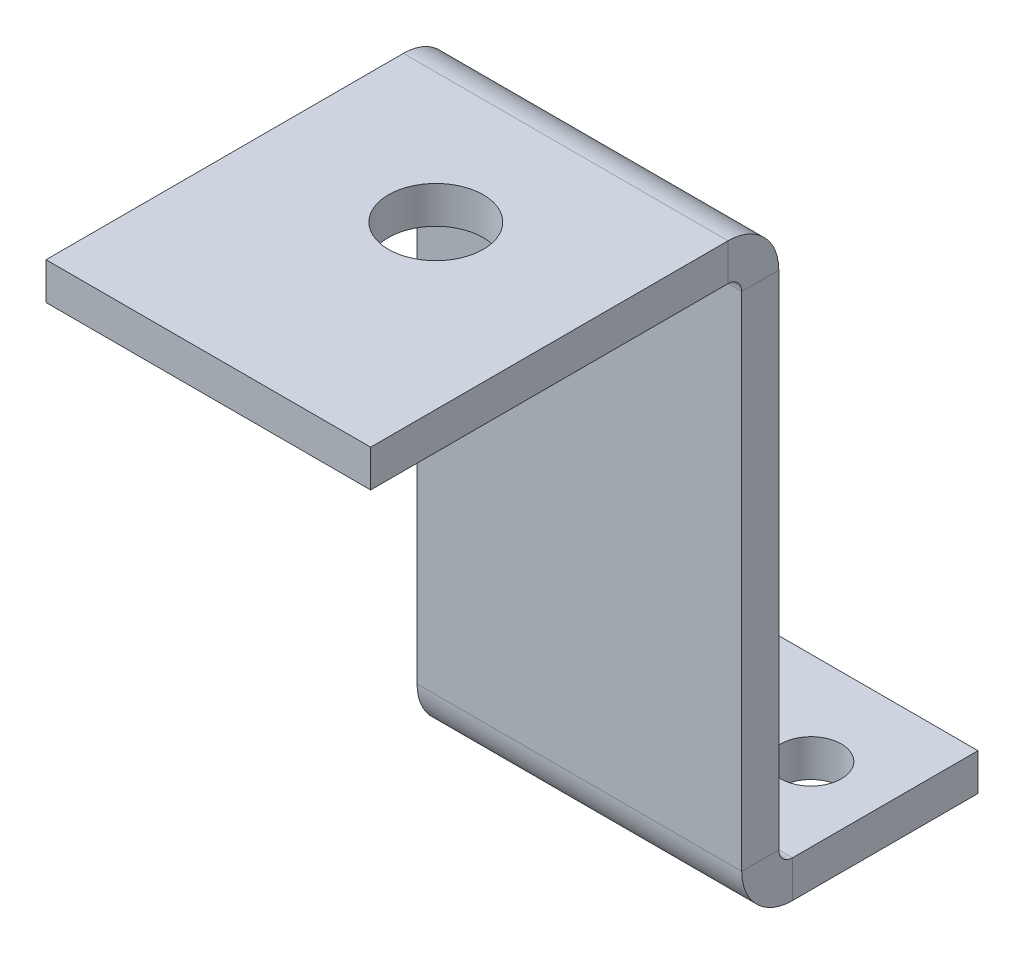
ISO-10303-21;
HEADER;
FILE_DESCRIPTION(('STEP AP214'),'2;1');
FILE_NAME('part.step','',(''),(''),'','','');
FILE_SCHEMA(('AUTOMOTIVE_DESIGN { 1 0 10303 214 1 1 1 1 }'));
ENDSEC;
DATA;
#1=APPLICATION_CONTEXT('core data for automotive mechanical design processes');
#2=APPLICATION_PROTOCOL_DEFINITION('international standard','automotive_design',2000,#1);
#3=PRODUCT_CONTEXT('',#1,'mechanical');
#4=PRODUCT('Part','Part','',(#3));
#5=PRODUCT_RELATED_PRODUCT_CATEGORY('part','',(#4));
#6=PRODUCT_DEFINITION_FORMATION('','',#4);
#7=PRODUCT_DEFINITION_CONTEXT('part definition',#1,'design');
#8=PRODUCT_DEFINITION('design','',#6,#7);
#9=PRODUCT_DEFINITION_SHAPE('','',#8);
#10=(LENGTH_UNIT() NAMED_UNIT(*) SI_UNIT(.MILLI.,.METRE.));
#11=(NAMED_UNIT(*) PLANE_ANGLE_UNIT() SI_UNIT($,.RADIAN.));
#12=(NAMED_UNIT(*) SI_UNIT($,.STERADIAN.) SOLID_ANGLE_UNIT());
#13=UNCERTAINTY_MEASURE_WITH_UNIT(LENGTH_MEASURE(1.E-05),#10,'distance_accuracy_value','');
#14=(GEOMETRIC_REPRESENTATION_CONTEXT(3) GLOBAL_UNCERTAINTY_ASSIGNED_CONTEXT((#13)) GLOBAL_UNIT_ASSIGNED_CONTEXT((#10,
#11,#12)) REPRESENTATION_CONTEXT('',''));
#15=CARTESIAN_POINT('',(0.,0.,0.));
#16=DIRECTION('',(0.,0.,1.));
#17=DIRECTION('',(1.,0.,0.));
#18=AXIS2_PLACEMENT_3D('',#15,#16,#17);
#19=CARTESIAN_POINT('',(0.,0.,0.));
#20=DIRECTION('',(0.,1.,0.));
#21=DIRECTION('',(0.,0.,1.));
#22=AXIS2_PLACEMENT_3D('',#19,#20,#21);
#23=PLANE('',#22);
#24=CARTESIAN_POINT('',(-19.2867132867133,0.,-16.3298368298368));
#25=DIRECTION('',(0.,1.,0.));
#26=DIRECTION('',(0.,0.,1.));
#27=AXIS2_PLACEMENT_3D('',#24,#25,#26);
#28=CIRCLE('',#27,1.63195);
#29=CARTESIAN_POINT('',(-19.2867132867133,0.,-14.6978868298368));
#30=VERTEX_POINT('',#29);
#31=EDGE_CURVE('E277',#30,#30,#28,.F.);
#32=ORIENTED_EDGE('',*,*,#31,.T.);
#33=EDGE_LOOP('',(#32));
#34=FACE_BOUND('',#33,.T.);
#35=DIRECTION('',(0.,0.,1.));
#36=VECTOR('',#35,1.);
#37=CARTESIAN_POINT('',(-23.2867132867133,0.,-21.3298368298368));
#38=LINE('',#37,#36);
#39=CARTESIAN_POINT('',(-23.2867132867133,0.,-21.3298368298368));
#40=VERTEX_POINT('',#39);
#41=CARTESIAN_POINT('',(-23.2867132867133,0.,-11.3298368298368));
#42=VERTEX_POINT('',#41);
#43=EDGE_CURVE('E286',#40,#42,#38,.T.);
#44=ORIENTED_EDGE('',*,*,#43,.T.);
#45=DIRECTION('',(1.,0.,0.));
#46=VECTOR('',#45,1.);
#47=CARTESIAN_POINT('',(-23.2867132867133,0.,-11.3298368298368));
#48=LINE('',#47,#46);
#49=CARTESIAN_POINT('',(-5.78671328671329,0.,-11.3298368298368));
#50=VERTEX_POINT('',#49);
#51=EDGE_CURVE('E298',#42,#50,#48,.T.);
#52=ORIENTED_EDGE('',*,*,#51,.T.);
#53=DIRECTION('',(0.,0.,-1.));
#54=VECTOR('',#53,1.);
#55=CARTESIAN_POINT('',(-5.78671328671329,0.,-21.3298368298368));
#56=LINE('',#55,#54);
#57=CARTESIAN_POINT('',(-5.78671328671329,0.,-21.3298368298368));
#58=VERTEX_POINT('',#57);
#59=EDGE_CURVE('E301',#50,#58,#56,.T.);
#60=ORIENTED_EDGE('',*,*,#59,.T.);
#61=DIRECTION('',(-1.,0.,0.));
#62=VECTOR('',#61,1.);
#63=CARTESIAN_POINT('',(-23.2867132867133,0.,-21.3298368298368));
#64=LINE('',#63,#62);
#65=EDGE_CURVE('E289',#58,#40,#64,.T.);
#66=ORIENTED_EDGE('',*,*,#65,.T.);
#67=EDGE_LOOP('',(#44,#52,#60,#66));
#68=FACE_BOUND('',#67,.T.);
#69=CARTESIAN_POINT('',(-9.78671328671328,0.,-16.3298368298368));
#70=DIRECTION('',(0.,1.,0.));
#71=DIRECTION('',(0.,0.,1.));
#72=AXIS2_PLACEMENT_3D('',#69,#70,#71);
#73=CIRCLE('',#72,1.63195);
#74=CARTESIAN_POINT('',(-9.78671328671328,0.,-14.6978868298368));
#75=VERTEX_POINT('',#74);
#76=EDGE_CURVE('E283',#75,#75,#73,.F.);
#77=ORIENTED_EDGE('',*,*,#76,.T.);
#78=EDGE_LOOP('',(#77));
#79=FACE_BOUND('',#78,.T.);
#80=ADVANCED_FACE('F83',(#34,#68,#79),#23,.T.);
#81=CARTESIAN_POINT('',(-23.2867132867133,-2.,-21.3298368298368));
#82=DIRECTION('',(-1.,0.,0.));
#83=DIRECTION('',(0.,0.,1.));
#84=AXIS2_PLACEMENT_3D('',#81,#82,#83);
#85=PLANE('',#84);
#86=ORIENTED_EDGE('',*,*,#43,.F.);
#87=DIRECTION('',(0.,1.,0.));
#88=VECTOR('',#87,1.);
#89=CARTESIAN_POINT('',(-23.2867132867133,-2.,-21.3298368298368));
#90=LINE('',#89,#88);
#91=CARTESIAN_POINT('',(-23.2867132867133,-2.,-21.3298368298368));
#92=VERTEX_POINT('',#91);
#93=EDGE_CURVE('E13',#92,#40,#90,.T.);
#94=ORIENTED_EDGE('',*,*,#93,.F.);
#95=DIRECTION('',(0.,0.,1.));
#96=VECTOR('',#95,1.);
#97=CARTESIAN_POINT('',(-23.2867132867133,-2.,-21.3298368298368));
#98=LINE('',#97,#96);
#99=CARTESIAN_POINT('',(-23.2867132867133,-2.,-11.3298368298368));
#100=VERTEX_POINT('',#99);
#101=EDGE_CURVE('E287',#92,#100,#98,.T.);
#102=ORIENTED_EDGE('',*,*,#101,.T.);
#103=DIRECTION('',(0.,1.,0.));
#104=VECTOR('',#103,1.);
#105=CARTESIAN_POINT('',(-23.2867132867133,-2.,-11.3298368298368));
#106=LINE('',#105,#104);
#107=EDGE_CURVE('E295',#100,#42,#106,.T.);
#108=ORIENTED_EDGE('',*,*,#107,.T.);
#109=EDGE_LOOP('',(#86,#94,#102,#108));
#110=FACE_BOUND('',#109,.T.);
#111=ADVANCED_FACE('F85',(#110),#85,.T.);
#112=CARTESIAN_POINT('',(-23.2867132867133,-2.,-21.3298368298368));
#113=DIRECTION('',(0.,0.,-1.));
#114=DIRECTION('',(-1.,0.,0.));
#115=AXIS2_PLACEMENT_3D('',#112,#113,#114);
#116=PLANE('',#115);
#117=ORIENTED_EDGE('',*,*,#65,.F.);
#118=DIRECTION('',(0.,1.,0.));
#119=VECTOR('',#118,1.);
#120=CARTESIAN_POINT('',(-5.78671328671329,-2.,-21.3298368298368));
#121=LINE('',#120,#119);
#122=CARTESIAN_POINT('',(-5.78671328671329,-2.,-21.3298368298368));
#123=VERTEX_POINT('',#122);
#124=EDGE_CURVE('E93',#123,#58,#121,.T.);
#125=ORIENTED_EDGE('',*,*,#124,.F.);
#126=DIRECTION('',(-1.,0.,0.));
#127=VECTOR('',#126,1.);
#128=CARTESIAN_POINT('',(-23.2867132867133,-2.,-21.3298368298368));
#129=LINE('',#128,#127);
#130=EDGE_CURVE('E293',#123,#92,#129,.T.);
#131=ORIENTED_EDGE('',*,*,#130,.T.);
#132=ORIENTED_EDGE('',*,*,#93,.T.);
#133=EDGE_LOOP('',(#117,#125,#131,#132));
#134=FACE_BOUND('',#133,.T.);
#135=ADVANCED_FACE('F372',(#134),#116,.T.);
#136=CARTESIAN_POINT('',(-5.78671328671329,-2.,-21.3298368298368));
#137=DIRECTION('',(1.,0.,0.));
#138=DIRECTION('',(0.,0.,-1.));
#139=AXIS2_PLACEMENT_3D('',#136,#137,#138);
#140=PLANE('',#139);
#141=ORIENTED_EDGE('',*,*,#59,.F.);
#142=DIRECTION('',(0.,1.,0.));
#143=VECTOR('',#142,1.);
#144=CARTESIAN_POINT('',(-5.78671328671329,-2.,-11.3298368298368));
#145=LINE('',#144,#143);
#146=CARTESIAN_POINT('',(-5.78671328671329,-2.,-11.3298368298368));
#147=VERTEX_POINT('',#146);
#148=EDGE_CURVE('E306',#147,#50,#145,.T.);
#149=ORIENTED_EDGE('',*,*,#148,.F.);
#150=DIRECTION('',(0.,0.,-1.));
#151=VECTOR('',#150,1.);
#152=CARTESIAN_POINT('',(-5.78671328671329,-2.,-21.3298368298368));
#153=LINE('',#152,#151);
#154=EDGE_CURVE('E291',#147,#123,#153,.T.);
#155=ORIENTED_EDGE('',*,*,#154,.T.);
#156=ORIENTED_EDGE('',*,*,#124,.T.);
#157=EDGE_LOOP('',(#141,#149,#155,#156));
#158=FACE_BOUND('',#157,.T.);
#159=ADVANCED_FACE('F378',(#158),#140,.T.);
#160=CARTESIAN_POINT('',(0.,-2.,0.));
#161=DIRECTION('',(0.,1.,0.));
#162=DIRECTION('',(0.,0.,1.));
#163=AXIS2_PLACEMENT_3D('',#160,#161,#162);
#164=PLANE('',#163);
#165=CARTESIAN_POINT('',(-19.2867132867133,-2.,-16.3298368298368));
#166=DIRECTION('',(0.,-1.,0.));
#167=DIRECTION('',(0.,0.,-1.));
#168=AXIS2_PLACEMENT_3D('',#165,#166,#167);
#169=CIRCLE('',#168,1.63195);
#170=CARTESIAN_POINT('',(-19.2867132867133,-2.,-17.9617868298368));
#171=VERTEX_POINT('',#170);
#172=EDGE_CURVE('E266',#171,#171,#169,.T.);
#173=ORIENTED_EDGE('',*,*,#172,.F.);
#174=EDGE_LOOP('',(#173));
#175=FACE_BOUND('',#174,.T.);
#176=CARTESIAN_POINT('',(-9.78671328671328,-2.,-16.3298368298368));
#177=DIRECTION('',(0.,-1.,0.));
#178=DIRECTION('',(0.,0.,-1.));
#179=AXIS2_PLACEMENT_3D('',#176,#177,#178);
#180=CIRCLE('',#179,1.63195);
#181=CARTESIAN_POINT('',(-9.78671328671328,-2.,-17.9617868298368));
#182=VERTEX_POINT('',#181);
#183=EDGE_CURVE('E280',#182,#182,#180,.T.);
#184=ORIENTED_EDGE('',*,*,#183,.F.);
#185=EDGE_LOOP('',(#184));
#186=FACE_BOUND('',#185,.T.);
#187=ORIENTED_EDGE('',*,*,#101,.F.);
#188=ORIENTED_EDGE('',*,*,#130,.F.);
#189=ORIENTED_EDGE('',*,*,#154,.F.);
#190=DIRECTION('',(1.,0.,0.));
#191=VECTOR('',#190,1.);
#192=CARTESIAN_POINT('',(-23.2867132867133,-2.,-11.3298368298368));
#193=LINE('',#192,#191);
#194=EDGE_CURVE('E125',#100,#147,#193,.T.);
#195=ORIENTED_EDGE('',*,*,#194,.F.);
#196=EDGE_LOOP('',(#187,#188,#189,#195));
#197=FACE_BOUND('',#196,.T.);
#198=ADVANCED_FACE('F375',(#175,#186,#197),#164,.F.);
#199=CARTESIAN_POINT('',(-9.78671328671328,-2.,-16.3298368298368));
#200=DIRECTION('',(0.,-1.,0.));
#201=DIRECTION('',(0.,0.,-1.));
#202=AXIS2_PLACEMENT_3D('',#199,#200,#201);
#203=CYLINDRICAL_SURFACE('',#202,1.63195);
#204=ORIENTED_EDGE('',*,*,#76,.F.);
#205=EDGE_LOOP('',(#204));
#206=FACE_BOUND('',#205,.T.);
#207=ORIENTED_EDGE('',*,*,#183,.T.);
#208=EDGE_LOOP('',(#207));
#209=FACE_BOUND('',#208,.T.);
#210=ADVANCED_FACE('F383',(#206,#209),#203,.F.);
#211=CARTESIAN_POINT('',(-19.2867132867133,-2.,-16.3298368298368));
#212=DIRECTION('',(0.,-1.,0.));
#213=DIRECTION('',(0.,0.,-1.));
#214=AXIS2_PLACEMENT_3D('',#211,#212,#213);
#215=CYLINDRICAL_SURFACE('',#214,1.63195);
#216=ORIENTED_EDGE('',*,*,#31,.F.);
#217=EDGE_LOOP('',(#216));
#218=FACE_BOUND('',#217,.T.);
#219=ORIENTED_EDGE('',*,*,#172,.T.);
#220=EDGE_LOOP('',(#219));
#221=FACE_BOUND('',#220,.T.);
#222=ADVANCED_FACE('F423',(#218,#221),#215,.F.);
#223=CARTESIAN_POINT('',(-23.2867132867133,0.736599999999997,-11.3298368298368));
#224=DIRECTION('',(-1.,0.,0.));
#225=DIRECTION('',(0.,0.,1.));
#226=AXIS2_PLACEMENT_3D('',#223,#224,#225);
#227=PLANE('',#226);
#228=DIRECTION('',(0.,0.,-1.));
#229=VECTOR('',#228,1.);
#230=CARTESIAN_POINT('',(-23.2867132867133,0.736599999999997,-8.59323682983683));
#231=LINE('',#230,#229);
#232=CARTESIAN_POINT('',(-23.2867132867133,0.736599999999997,-10.5932368298368));
#233=VERTEX_POINT('',#232);
#234=CARTESIAN_POINT('',(-23.2867132867133,0.736599999999997,-8.59323682983683));
#235=VERTEX_POINT('',#234);
#236=EDGE_CURVE('E222',#233,#235,#231,.F.);
#237=ORIENTED_EDGE('',*,*,#236,.F.);
#238=CARTESIAN_POINT('',(-23.2867132867133,0.736599999999997,-11.3298368298368));
#239=DIRECTION('',(1.,0.,0.));
#240=DIRECTION('',(0.,0.,-1.));
#241=AXIS2_PLACEMENT_3D('',#238,#239,#240);
#242=CIRCLE('',#241,0.736599999999997);
#243=EDGE_CURVE('E270',#42,#233,#242,.F.);
#244=ORIENTED_EDGE('',*,*,#243,.F.);
#245=ORIENTED_EDGE('',*,*,#107,.F.);
#246=CARTESIAN_POINT('',(-23.2867132867133,0.736599999999997,-11.3298368298368));
#247=DIRECTION('',(1.,0.,0.));
#248=DIRECTION('',(0.,0.,-1.));
#249=AXIS2_PLACEMENT_3D('',#246,#247,#248);
#250=CIRCLE('',#249,2.7366);
#251=EDGE_CURVE('E263',#100,#235,#250,.F.);
#252=ORIENTED_EDGE('',*,*,#251,.T.);
#253=EDGE_LOOP('',(#237,#244,#245,#252));
#254=FACE_BOUND('',#253,.T.);
#255=ADVANCED_FACE('F319',(#254),#227,.T.);
#256=CARTESIAN_POINT('',(-5.78671328671329,0.736599999999997,-11.3298368298368));
#257=DIRECTION('',(-1.,0.,0.));
#258=DIRECTION('',(0.,0.,1.));
#259=AXIS2_PLACEMENT_3D('',#256,#257,#258);
#260=PLANE('',#259);
#261=CARTESIAN_POINT('',(-5.78671328671329,0.736599999999997,-11.3298368298368));
#262=DIRECTION('',(1.,0.,0.));
#263=DIRECTION('',(0.,0.,-1.));
#264=AXIS2_PLACEMENT_3D('',#261,#262,#263);
#265=CIRCLE('',#264,0.736599999999997);
#266=CARTESIAN_POINT('',(-5.78671328671329,0.736599999999997,-10.5932368298368));
#267=VERTEX_POINT('',#266);
#268=EDGE_CURVE('E235',#267,#50,#265,.T.);
#269=ORIENTED_EDGE('',*,*,#268,.F.);
#270=DIRECTION('',(0.,0.,-1.));
#271=VECTOR('',#270,1.);
#272=CARTESIAN_POINT('',(-5.78671328671329,0.736599999999997,-10.5932368298368));
#273=LINE('',#272,#271);
#274=CARTESIAN_POINT('',(-5.78671328671329,0.736599999999997,-8.59323682983683));
#275=VERTEX_POINT('',#274);
#276=EDGE_CURVE('E256',#267,#275,#273,.F.);
#277=ORIENTED_EDGE('',*,*,#276,.T.);
#278=CARTESIAN_POINT('',(-5.78671328671329,0.736599999999997,-11.3298368298368));
#279=DIRECTION('',(1.,0.,0.));
#280=DIRECTION('',(0.,0.,-1.));
#281=AXIS2_PLACEMENT_3D('',#278,#279,#280);
#282=CIRCLE('',#281,2.7366);
#283=EDGE_CURVE('E267',#275,#147,#282,.T.);
#284=ORIENTED_EDGE('',*,*,#283,.T.);
#285=ORIENTED_EDGE('',*,*,#148,.T.);
#286=EDGE_LOOP('',(#269,#277,#284,#285));
#287=FACE_BOUND('',#286,.T.);
#288=ADVANCED_FACE('F390',(#287),#260,.F.);
#289=CARTESIAN_POINT('',(-5.78671328671329,0.736599999999997,-11.3298368298368));
#290=DIRECTION('',(1.,0.,0.));
#291=DIRECTION('',(0.,0.,1.));
#292=AXIS2_PLACEMENT_3D('',#289,#290,#291);
#293=CYLINDRICAL_SURFACE('',#292,2.7366);
#294=ORIENTED_EDGE('',*,*,#194,.T.);
#295=ORIENTED_EDGE('',*,*,#283,.F.);
#296=DIRECTION('',(1.,0.,0.));
#297=VECTOR('',#296,1.);
#298=CARTESIAN_POINT('',(-23.2867132867133,0.736599999999997,-8.59323682983683));
#299=LINE('',#298,#297);
#300=EDGE_CURVE('E254',#275,#235,#299,.F.);
#301=ORIENTED_EDGE('',*,*,#300,.T.);
#302=ORIENTED_EDGE('',*,*,#251,.F.);
#303=EDGE_LOOP('',(#294,#295,#301,#302));
#304=FACE_BOUND('',#303,.T.);
#305=ADVANCED_FACE('F389',(#304),#293,.T.);
#306=CARTESIAN_POINT('',(-5.78671328671329,0.736599999999997,-11.3298368298368));
#307=DIRECTION('',(1.,0.,0.));
#308=DIRECTION('',(0.,0.,1.));
#309=AXIS2_PLACEMENT_3D('',#306,#307,#308);
#310=CYLINDRICAL_SURFACE('',#309,0.736599999999997);
#311=ORIENTED_EDGE('',*,*,#51,.F.);
#312=ORIENTED_EDGE('',*,*,#243,.T.);
#313=DIRECTION('',(1.,0.,0.));
#314=VECTOR('',#313,1.);
#315=CARTESIAN_POINT('',(-23.2867132867133,0.736599999999997,-10.5932368298368));
#316=LINE('',#315,#314);
#317=EDGE_CURVE('E259',#233,#267,#316,.T.);
#318=ORIENTED_EDGE('',*,*,#317,.T.);
#319=ORIENTED_EDGE('',*,*,#268,.T.);
#320=EDGE_LOOP('',(#311,#312,#318,#319));
#321=FACE_BOUND('',#320,.T.);
#322=ADVANCED_FACE('F316',(#321),#310,.F.);
#323=CARTESIAN_POINT('',(-23.2867132867133,0.,-8.59323682983683));
#324=DIRECTION('',(1.,0.,0.));
#325=DIRECTION('',(0.,0.,-1.));
#326=AXIS2_PLACEMENT_3D('',#323,#324,#325);
#327=PLANE('',#326);
#328=ORIENTED_EDGE('',*,*,#236,.T.);
#329=DIRECTION('',(0.,-1.,0.));
#330=VECTOR('',#329,1.);
#331=CARTESIAN_POINT('',(-23.2867132867133,0.,-8.59323682983683));
#332=LINE('',#331,#330);
#333=CARTESIAN_POINT('',(-23.2867132867133,27.8,-8.59323682983683));
#334=VERTEX_POINT('',#333);
#335=EDGE_CURVE('E243',#334,#235,#332,.T.);
#336=ORIENTED_EDGE('',*,*,#335,.F.);
#337=DIRECTION('',(0.,0.,-1.));
#338=VECTOR('',#337,1.);
#339=CARTESIAN_POINT('',(-23.2867132867133,27.8,-8.59323682983683));
#340=LINE('',#339,#338);
#341=CARTESIAN_POINT('',(-23.2867132867133,27.8,-10.5932368298368));
#342=VERTEX_POINT('',#341);
#343=EDGE_CURVE('E236',#334,#342,#340,.T.);
#344=ORIENTED_EDGE('',*,*,#343,.T.);
#345=DIRECTION('',(0.,1.,0.));
#346=VECTOR('',#345,1.);
#347=CARTESIAN_POINT('',(-23.2867132867133,0.,-10.5932368298368));
#348=LINE('',#347,#346);
#349=EDGE_CURVE('E251',#342,#233,#348,.F.);
#350=ORIENTED_EDGE('',*,*,#349,.T.);
#351=EDGE_LOOP('',(#328,#336,#344,#350));
#352=FACE_BOUND('',#351,.T.);
#353=ADVANCED_FACE('F322',(#352),#327,.F.);
#354=CARTESIAN_POINT('',(-5.78671328671329,27.8,-8.59323682983683));
#355=DIRECTION('',(-1.,0.,0.));
#356=DIRECTION('',(0.,0.,1.));
#357=AXIS2_PLACEMENT_3D('',#354,#355,#356);
#358=PLANE('',#357);
#359=ORIENTED_EDGE('',*,*,#276,.F.);
#360=DIRECTION('',(0.,-1.,0.));
#361=VECTOR('',#360,1.);
#362=CARTESIAN_POINT('',(-5.78671328671329,27.8,-10.5932368298368));
#363=LINE('',#362,#361);
#364=CARTESIAN_POINT('',(-5.78671328671329,27.8,-10.5932368298368));
#365=VERTEX_POINT('',#364);
#366=EDGE_CURVE('E249',#267,#365,#363,.F.);
#367=ORIENTED_EDGE('',*,*,#366,.T.);
#368=DIRECTION('',(0.,0.,-1.));
#369=VECTOR('',#368,1.);
#370=CARTESIAN_POINT('',(-5.78671328671329,27.8,-8.59323682983683));
#371=LINE('',#370,#369);
#372=CARTESIAN_POINT('',(-5.78671328671329,27.8,-8.59323682983683));
#373=VERTEX_POINT('',#372);
#374=EDGE_CURVE('E232',#373,#365,#371,.T.);
#375=ORIENTED_EDGE('',*,*,#374,.F.);
#376=DIRECTION('',(0.,1.,0.));
#377=VECTOR('',#376,1.);
#378=CARTESIAN_POINT('',(-5.78671328671329,0.,-8.59323682983683));
#379=LINE('',#378,#377);
#380=EDGE_CURVE('E241',#275,#373,#379,.T.);
#381=ORIENTED_EDGE('',*,*,#380,.F.);
#382=EDGE_LOOP('',(#359,#367,#375,#381));
#383=FACE_BOUND('',#382,.T.);
#384=ADVANCED_FACE('F394',(#383),#358,.F.);
#385=CARTESIAN_POINT('',(0.,0.,-8.59323682983683));
#386=DIRECTION('',(0.,0.,-1.));
#387=DIRECTION('',(-1.,0.,0.));
#388=AXIS2_PLACEMENT_3D('',#385,#386,#387);
#389=PLANE('',#388);
#390=ORIENTED_EDGE('',*,*,#300,.F.);
#391=ORIENTED_EDGE('',*,*,#380,.T.);
#392=DIRECTION('',(-1.,0.,0.));
#393=VECTOR('',#392,1.);
#394=CARTESIAN_POINT('',(0.,27.8,-8.59323682983683));
#395=LINE('',#394,#393);
#396=EDGE_CURVE('E239',#373,#334,#395,.T.);
#397=ORIENTED_EDGE('',*,*,#396,.T.);
#398=ORIENTED_EDGE('',*,*,#335,.T.);
#399=EDGE_LOOP('',(#390,#391,#397,#398));
#400=FACE_BOUND('',#399,.T.);
#401=ADVANCED_FACE('F326',(#400),#389,.F.);
#402=CARTESIAN_POINT('',(0.,0.,-10.5932368298368));
#403=DIRECTION('',(0.,0.,-1.));
#404=DIRECTION('',(-1.,0.,0.));
#405=AXIS2_PLACEMENT_3D('',#402,#403,#404);
#406=PLANE('',#405);
#407=ORIENTED_EDGE('',*,*,#366,.F.);
#408=ORIENTED_EDGE('',*,*,#317,.F.);
#409=ORIENTED_EDGE('',*,*,#349,.F.);
#410=DIRECTION('',(1.,0.,0.));
#411=VECTOR('',#410,1.);
#412=CARTESIAN_POINT('',(-23.2867132867133,27.8,-10.5932368298368));
#413=LINE('',#412,#411);
#414=EDGE_CURVE('E246',#365,#342,#413,.F.);
#415=ORIENTED_EDGE('',*,*,#414,.F.);
#416=EDGE_LOOP('',(#407,#408,#409,#415));
#417=FACE_BOUND('',#416,.T.);
#418=ADVANCED_FACE('F396',(#417),#406,.T.);
#419=CARTESIAN_POINT('',(-5.78671328671329,27.8,-7.85663682983683));
#420=DIRECTION('',(1.,0.,0.));
#421=DIRECTION('',(0.,0.,-1.));
#422=AXIS2_PLACEMENT_3D('',#419,#420,#421);
#423=PLANE('',#422);
#424=DIRECTION('',(0.,-1.,0.));
#425=VECTOR('',#424,1.);
#426=CARTESIAN_POINT('',(-5.78671328671329,30.5366,-7.85663682983684));
#427=LINE('',#426,#425);
#428=CARTESIAN_POINT('',(-5.78671328671329,28.5366,-7.85663682983683));
#429=VERTEX_POINT('',#428);
#430=CARTESIAN_POINT('',(-5.78671328671329,30.5366,-7.85663682983684));
#431=VERTEX_POINT('',#430);
#432=EDGE_CURVE('E202',#429,#431,#427,.F.);
#433=ORIENTED_EDGE('',*,*,#432,.F.);
#434=CARTESIAN_POINT('',(-5.78671328671329,27.8,-7.85663682983683));
#435=DIRECTION('',(-1.,0.,0.));
#436=DIRECTION('',(0.,0.,1.));
#437=AXIS2_PLACEMENT_3D('',#434,#435,#436);
#438=CIRCLE('',#437,0.7366);
#439=EDGE_CURVE('E226',#373,#429,#438,.F.);
#440=ORIENTED_EDGE('',*,*,#439,.F.);
#441=ORIENTED_EDGE('',*,*,#374,.T.);
#442=CARTESIAN_POINT('',(-5.78671328671329,27.8,-7.85663682983683));
#443=DIRECTION('',(-1.,0.,0.));
#444=DIRECTION('',(0.,0.,1.));
#445=AXIS2_PLACEMENT_3D('',#442,#443,#444);
#446=CIRCLE('',#445,2.7366);
#447=EDGE_CURVE('E219',#365,#431,#446,.F.);
#448=ORIENTED_EDGE('',*,*,#447,.T.);
#449=EDGE_LOOP('',(#433,#440,#441,#448));
#450=FACE_BOUND('',#449,.T.);
#451=ADVANCED_FACE('F336',(#450),#423,.T.);
#452=CARTESIAN_POINT('',(-23.2867132867133,27.8,-7.85663682983683));
#453=DIRECTION('',(1.,0.,0.));
#454=DIRECTION('',(0.,0.,-1.));
#455=AXIS2_PLACEMENT_3D('',#452,#453,#454);
#456=PLANE('',#455);
#457=CARTESIAN_POINT('',(-23.2867132867133,27.8,-7.85663682983683));
#458=DIRECTION('',(-1.,0.,0.));
#459=DIRECTION('',(0.,0.,1.));
#460=AXIS2_PLACEMENT_3D('',#457,#458,#459);
#461=CIRCLE('',#460,0.7366);
#462=CARTESIAN_POINT('',(-23.2867132867133,28.5366,-7.85663682983683));
#463=VERTEX_POINT('',#462);
#464=EDGE_CURVE('E229',#463,#334,#461,.T.);
#465=ORIENTED_EDGE('',*,*,#464,.F.);
#466=DIRECTION('',(0.,-1.,0.));
#467=VECTOR('',#466,1.);
#468=CARTESIAN_POINT('',(-23.2867132867133,28.5366,-7.85663682983683));
#469=LINE('',#468,#467);
#470=CARTESIAN_POINT('',(-23.2867132867133,30.5366,-7.85663682983684));
#471=VERTEX_POINT('',#470);
#472=EDGE_CURVE('E213',#463,#471,#469,.F.);
#473=ORIENTED_EDGE('',*,*,#472,.T.);
#474=CARTESIAN_POINT('',(-23.2867132867133,27.8,-7.85663682983683));
#475=DIRECTION('',(-1.,0.,0.));
#476=DIRECTION('',(0.,0.,1.));
#477=AXIS2_PLACEMENT_3D('',#474,#475,#476);
#478=CIRCLE('',#477,2.7366);
#479=EDGE_CURVE('E223',#471,#342,#478,.T.);
#480=ORIENTED_EDGE('',*,*,#479,.T.);
#481=ORIENTED_EDGE('',*,*,#343,.F.);
#482=EDGE_LOOP('',(#465,#473,#480,#481));
#483=FACE_BOUND('',#482,.T.);
#484=ADVANCED_FACE('F398',(#483),#456,.F.);
#485=CARTESIAN_POINT('',(-23.2867132867133,27.8,-7.85663682983683));
#486=DIRECTION('',(-1.,0.,0.));
#487=DIRECTION('',(0.,1.,0.));
#488=AXIS2_PLACEMENT_3D('',#485,#486,#487);
#489=CYLINDRICAL_SURFACE('',#488,2.7366);
#490=ORIENTED_EDGE('',*,*,#414,.T.);
#491=ORIENTED_EDGE('',*,*,#479,.F.);
#492=DIRECTION('',(-1.,0.,0.));
#493=VECTOR('',#492,1.);
#494=CARTESIAN_POINT('',(-5.78671328671329,30.5366,-7.85663682983684));
#495=LINE('',#494,#493);
#496=EDGE_CURVE('E211',#471,#431,#495,.F.);
#497=ORIENTED_EDGE('',*,*,#496,.T.);
#498=ORIENTED_EDGE('',*,*,#447,.F.);
#499=EDGE_LOOP('',(#490,#491,#497,#498));
#500=FACE_BOUND('',#499,.T.);
#501=ADVANCED_FACE('F339',(#500),#489,.T.);
#502=CARTESIAN_POINT('',(-23.2867132867133,27.8,-7.85663682983683));
#503=DIRECTION('',(-1.,0.,0.));
#504=DIRECTION('',(0.,1.,0.));
#505=AXIS2_PLACEMENT_3D('',#502,#503,#504);
#506=CYLINDRICAL_SURFACE('',#505,0.7366);
#507=ORIENTED_EDGE('',*,*,#396,.F.);
#508=ORIENTED_EDGE('',*,*,#439,.T.);
#509=DIRECTION('',(-1.,0.,0.));
#510=VECTOR('',#509,1.);
#511=CARTESIAN_POINT('',(-5.78671328671329,28.5366,-7.85663682983683));
#512=LINE('',#511,#510);
#513=EDGE_CURVE('E216',#429,#463,#512,.T.);
#514=ORIENTED_EDGE('',*,*,#513,.T.);
#515=ORIENTED_EDGE('',*,*,#464,.T.);
#516=EDGE_LOOP('',(#507,#508,#514,#515));
#517=FACE_BOUND('',#516,.T.);
#518=ADVANCED_FACE('F332',(#517),#506,.F.);
#519=CARTESIAN_POINT('',(-5.78671328671329,30.5366,-8.59323682983684));
#520=DIRECTION('',(-1.,0.,0.));
#521=DIRECTION('',(0.,0.,1.));
#522=AXIS2_PLACEMENT_3D('',#519,#520,#521);
#523=PLANE('',#522);
#524=ORIENTED_EDGE('',*,*,#432,.T.);
#525=DIRECTION('',(0.,0.,-1.));
#526=VECTOR('',#525,1.);
#527=CARTESIAN_POINT('',(-5.78671328671329,30.5366,-1.03433587941997E-13));
#528=LINE('',#527,#526);
#529=CARTESIAN_POINT('',(-5.78671328671329,30.5366000000001,11.4067631701632));
#530=VERTEX_POINT('',#529);
#531=EDGE_CURVE('E183',#530,#431,#528,.T.);
#532=ORIENTED_EDGE('',*,*,#531,.F.);
#533=DIRECTION('',(0.,-1.,0.));
#534=VECTOR('',#533,1.);
#535=CARTESIAN_POINT('',(-5.78671328671329,30.5366000000001,11.4067631701632));
#536=LINE('',#535,#534);
#537=CARTESIAN_POINT('',(-5.78671328671329,28.5366000000001,11.4067631701632));
#538=VERTEX_POINT('',#537);
#539=EDGE_CURVE('E189',#530,#538,#536,.T.);
#540=ORIENTED_EDGE('',*,*,#539,.T.);
#541=DIRECTION('',(0.,0.,1.));
#542=VECTOR('',#541,1.);
#543=CARTESIAN_POINT('',(-5.78671328671329,28.5366,-8.59323682983683));
#544=LINE('',#543,#542);
#545=EDGE_CURVE('E209',#538,#429,#544,.F.);
#546=ORIENTED_EDGE('',*,*,#545,.T.);
#547=EDGE_LOOP('',(#524,#532,#540,#546));
#548=FACE_BOUND('',#547,.T.);
#549=ADVANCED_FACE('F201',(#548),#523,.F.);
#550=CARTESIAN_POINT('',(-23.2867132867133,30.5366000000001,11.4067631701632));
#551=DIRECTION('',(1.,0.,0.));
#552=DIRECTION('',(0.,0.,-1.));
#553=AXIS2_PLACEMENT_3D('',#550,#551,#552);
#554=PLANE('',#553);
#555=ORIENTED_EDGE('',*,*,#472,.F.);
#556=DIRECTION('',(0.,0.,-1.));
#557=VECTOR('',#556,1.);
#558=CARTESIAN_POINT('',(-23.2867132867133,28.5366000000001,11.4067631701632));
#559=LINE('',#558,#557);
#560=CARTESIAN_POINT('',(-23.2867132867133,28.5366000000001,11.4067631701632));
#561=VERTEX_POINT('',#560);
#562=EDGE_CURVE('E205',#463,#561,#559,.F.);
#563=ORIENTED_EDGE('',*,*,#562,.T.);
#564=DIRECTION('',(0.,-1.,0.));
#565=VECTOR('',#564,1.);
#566=CARTESIAN_POINT('',(-23.2867132867133,30.5366000000001,11.4067631701632));
#567=LINE('',#566,#565);
#568=CARTESIAN_POINT('',(-23.2867132867133,30.5366000000001,11.4067631701632));
#569=VERTEX_POINT('',#568);
#570=EDGE_CURVE('E198',#569,#561,#567,.T.);
#571=ORIENTED_EDGE('',*,*,#570,.F.);
#572=DIRECTION('',(0.,0.,1.));
#573=VECTOR('',#572,1.);
#574=CARTESIAN_POINT('',(-23.2867132867133,30.5366,-1.03433587941997E-13));
#575=LINE('',#574,#573);
#576=EDGE_CURVE('E185',#471,#569,#575,.T.);
#577=ORIENTED_EDGE('',*,*,#576,.F.);
#578=EDGE_LOOP('',(#555,#563,#571,#577));
#579=FACE_BOUND('',#578,.T.);
#580=ADVANCED_FACE('F343',(#579),#554,.F.);
#581=CARTESIAN_POINT('',(0.,30.5366,-1.03433587941997E-13));
#582=DIRECTION('',(0.,-1.,0.));
#583=DIRECTION('',(0.,0.,-1.));
#584=AXIS2_PLACEMENT_3D('',#581,#582,#583);
#585=PLANE('',#584);
#586=CARTESIAN_POINT('',(-14.5367132867133,30.5366,-0.856636829836833));
#587=DIRECTION('',(0.,-1.,0.));
#588=DIRECTION('',(0.,0.,-1.));
#589=AXIS2_PLACEMENT_3D('',#586,#587,#588);
#590=CIRCLE('',#589,2.55269999999999);
#591=CARTESIAN_POINT('',(-14.5367132867133,30.5366,-3.40933682983682));
#592=VERTEX_POINT('',#591);
#593=EDGE_CURVE('E87',#592,#592,#590,.T.);
#594=ORIENTED_EDGE('',*,*,#593,.T.);
#595=EDGE_LOOP('',(#594));
#596=FACE_BOUND('',#595,.T.);
#597=ORIENTED_EDGE('',*,*,#496,.F.);
#598=ORIENTED_EDGE('',*,*,#576,.T.);
#599=DIRECTION('',(1.,0.,0.));
#600=VECTOR('',#599,1.);
#601=CARTESIAN_POINT('',(0.,30.5366000000001,11.4067631701632));
#602=LINE('',#601,#600);
#603=EDGE_CURVE('E178',#569,#530,#602,.T.);
#604=ORIENTED_EDGE('',*,*,#603,.T.);
#605=ORIENTED_EDGE('',*,*,#531,.T.);
#606=EDGE_LOOP('',(#597,#598,#604,#605));
#607=FACE_BOUND('',#606,.T.);
#608=ADVANCED_FACE('F181',(#596,#607),#585,.F.);
#609=CARTESIAN_POINT('',(0.,28.5366,0.));
#610=DIRECTION('',(0.,-1.,0.));
#611=DIRECTION('',(0.,0.,-1.));
#612=AXIS2_PLACEMENT_3D('',#609,#610,#611);
#613=PLANE('',#612);
#614=CARTESIAN_POINT('',(-14.5367132867133,28.5366,-0.856636829836833));
#615=DIRECTION('',(0.,-1.,0.));
#616=DIRECTION('',(0.,0.,-1.));
#617=AXIS2_PLACEMENT_3D('',#614,#615,#616);
#618=CIRCLE('',#617,2.55269999999999);
#619=CARTESIAN_POINT('',(-14.5367132867133,28.5366,-3.40933682983682));
#620=VERTEX_POINT('',#619);
#621=EDGE_CURVE('E347',#620,#620,#618,.T.);
#622=ORIENTED_EDGE('',*,*,#621,.F.);
#623=EDGE_LOOP('',(#622));
#624=FACE_BOUND('',#623,.T.);
#625=ORIENTED_EDGE('',*,*,#562,.F.);
#626=ORIENTED_EDGE('',*,*,#513,.F.);
#627=ORIENTED_EDGE('',*,*,#545,.F.);
#628=DIRECTION('',(-1.,0.,0.));
#629=VECTOR('',#628,1.);
#630=CARTESIAN_POINT('',(-5.78671328671329,28.5366000000001,11.4067631701632));
#631=LINE('',#630,#629);
#632=EDGE_CURVE('E194',#561,#538,#631,.F.);
#633=ORIENTED_EDGE('',*,*,#632,.F.);
#634=EDGE_LOOP('',(#625,#626,#627,#633));
#635=FACE_BOUND('',#634,.T.);
#636=ADVANCED_FACE('F362',(#624,#635),#613,.T.);
#637=CARTESIAN_POINT('',(-5.78671328671329,30.5366000000001,11.4067631701632));
#638=DIRECTION('',(0.,0.,-1.));
#639=DIRECTION('',(0.,1.,0.));
#640=AXIS2_PLACEMENT_3D('',#637,#638,#639);
#641=PLANE('',#640);
#642=ORIENTED_EDGE('',*,*,#632,.T.);
#643=ORIENTED_EDGE('',*,*,#539,.F.);
#644=ORIENTED_EDGE('',*,*,#603,.F.);
#645=ORIENTED_EDGE('',*,*,#570,.T.);
#646=EDGE_LOOP('',(#642,#643,#644,#645));
#647=FACE_BOUND('',#646,.T.);
#648=ADVANCED_FACE('F192',(#647),#641,.F.);
#649=CARTESIAN_POINT('',(-14.5367132867133,28.5366,-0.856636829836833));
#650=DIRECTION('',(0.,-1.,0.));
#651=DIRECTION('',(0.,0.,-1.));
#652=AXIS2_PLACEMENT_3D('',#649,#650,#651);
#653=CYLINDRICAL_SURFACE('',#652,2.55269999999999);
#654=ORIENTED_EDGE('',*,*,#621,.T.);
#655=EDGE_LOOP('',(#654));
#656=FACE_BOUND('',#655,.T.);
#657=ORIENTED_EDGE('',*,*,#593,.F.);
#658=EDGE_LOOP('',(#657));
#659=FACE_BOUND('',#658,.T.);
#660=ADVANCED_FACE('F355',(#656,#659),#653,.F.);
#661=CLOSED_SHELL('',(#80,#111,#135,#159,#198,#210,#222,#255,#288,#305,#322,#353,#384,#401,#418,
#451,#484,#501,#518,#549,#580,#608,#636,#648,#660));
#662=MANIFOLD_SOLID_BREP('B2',#661);
#663=ADVANCED_BREP_SHAPE_REPRESENTATION('',(#18,#662),#14);
#664=SHAPE_DEFINITION_REPRESENTATION(#9,#663);
ENDSEC;
END-ISO-10303-21;
